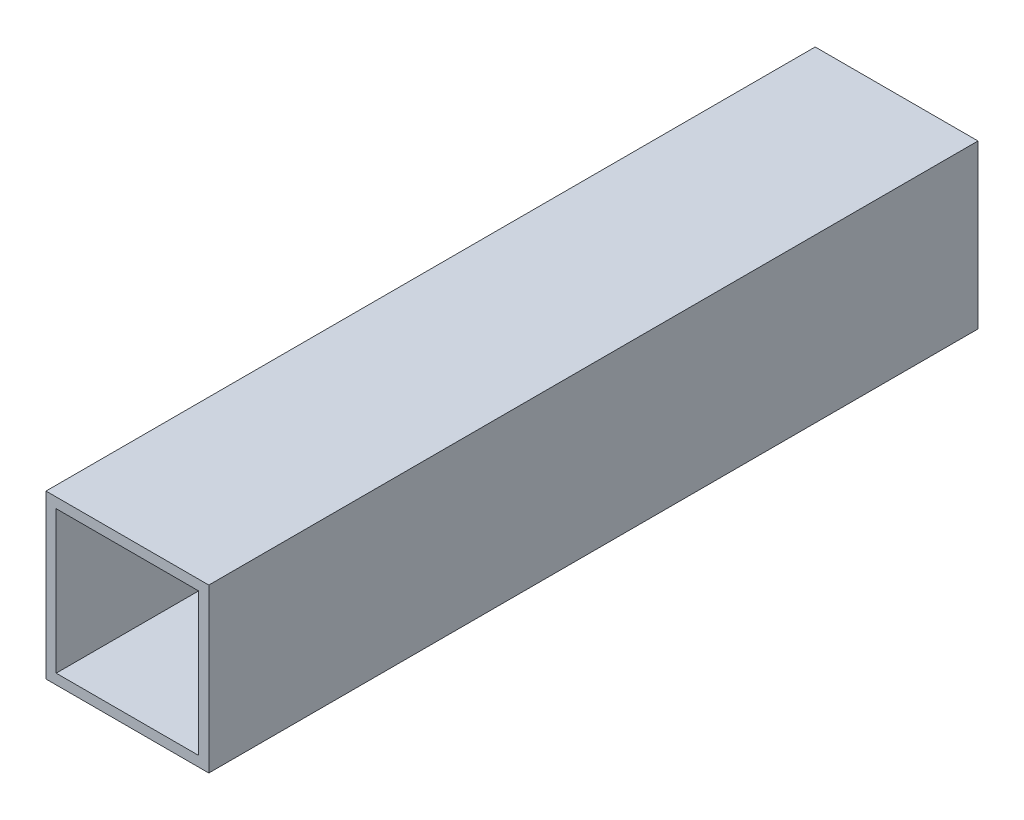
ISO-10303-21;
HEADER;
FILE_DESCRIPTION(('STEP AP214'),'2;1');
FILE_NAME('part.step','',(''),(''),'','','');
FILE_SCHEMA(('AUTOMOTIVE_DESIGN { 1 0 10303 214 1 1 1 1 }'));
ENDSEC;
DATA;
#1=APPLICATION_CONTEXT('core data for automotive mechanical design processes');
#2=APPLICATION_PROTOCOL_DEFINITION('international standard','automotive_design',2000,#1);
#3=PRODUCT_CONTEXT('',#1,'mechanical');
#4=PRODUCT('Part','Part','',(#3));
#5=PRODUCT_RELATED_PRODUCT_CATEGORY('part','',(#4));
#6=PRODUCT_DEFINITION_FORMATION('','',#4);
#7=PRODUCT_DEFINITION_CONTEXT('part definition',#1,'design');
#8=PRODUCT_DEFINITION('design','',#6,#7);
#9=PRODUCT_DEFINITION_SHAPE('','',#8);
#10=(LENGTH_UNIT() NAMED_UNIT(*) SI_UNIT(.MILLI.,.METRE.));
#11=(NAMED_UNIT(*) PLANE_ANGLE_UNIT() SI_UNIT($,.RADIAN.));
#12=(NAMED_UNIT(*) SI_UNIT($,.STERADIAN.) SOLID_ANGLE_UNIT());
#13=UNCERTAINTY_MEASURE_WITH_UNIT(LENGTH_MEASURE(1.E-05),#10,'distance_accuracy_value','');
#14=(GEOMETRIC_REPRESENTATION_CONTEXT(3) GLOBAL_UNCERTAINTY_ASSIGNED_CONTEXT((#13)) GLOBAL_UNIT_ASSIGNED_CONTEXT((#10,
#11,#12)) REPRESENTATION_CONTEXT('',''));
#15=CARTESIAN_POINT('',(0.,0.,0.));
#16=DIRECTION('',(0.,0.,1.));
#17=DIRECTION('',(1.,0.,0.));
#18=AXIS2_PLACEMENT_3D('',#15,#16,#17);
#19=CARTESIAN_POINT('',(0.,0.,120.));
#20=DIRECTION('',(0.,0.,-1.));
#21=DIRECTION('',(-1.,0.,0.));
#22=AXIS2_PLACEMENT_3D('',#19,#20,#21);
#23=PLANE('',#22);
#24=DIRECTION('',(0.,1.,0.));
#25=VECTOR('',#24,1.);
#26=CARTESIAN_POINT('',(12.7,-12.7,120.));
#27=LINE('',#26,#25);
#28=CARTESIAN_POINT('',(12.7,-12.7,120.));
#29=VERTEX_POINT('',#28);
#30=CARTESIAN_POINT('',(12.7,12.7,120.));
#31=VERTEX_POINT('',#30);
#32=EDGE_CURVE('E134',#29,#31,#27,.T.);
#33=ORIENTED_EDGE('',*,*,#32,.T.);
#34=DIRECTION('',(-1.,0.,0.));
#35=VECTOR('',#34,1.);
#36=CARTESIAN_POINT('',(-12.7,12.7,120.));
#37=LINE('',#36,#35);
#38=CARTESIAN_POINT('',(-12.7,12.7,120.));
#39=VERTEX_POINT('',#38);
#40=EDGE_CURVE('E137',#31,#39,#37,.T.);
#41=ORIENTED_EDGE('',*,*,#40,.T.);
#42=DIRECTION('',(0.,-1.,0.));
#43=VECTOR('',#42,1.);
#44=CARTESIAN_POINT('',(-12.7,-12.7,120.));
#45=LINE('',#44,#43);
#46=CARTESIAN_POINT('',(-12.7,-12.7,120.));
#47=VERTEX_POINT('',#46);
#48=EDGE_CURVE('E140',#39,#47,#45,.T.);
#49=ORIENTED_EDGE('',*,*,#48,.T.);
#50=DIRECTION('',(1.,0.,0.));
#51=VECTOR('',#50,1.);
#52=CARTESIAN_POINT('',(-12.7,-12.7,120.));
#53=LINE('',#52,#51);
#54=EDGE_CURVE('E142',#47,#29,#53,.T.);
#55=ORIENTED_EDGE('',*,*,#54,.T.);
#56=EDGE_LOOP('',(#33,#41,#49,#55));
#57=FACE_BOUND('',#56,.T.);
#58=DIRECTION('',(0.,1.,0.));
#59=VECTOR('',#58,1.);
#60=CARTESIAN_POINT('',(11.1125,-11.1125000000001,120.));
#61=LINE('',#60,#59);
#62=CARTESIAN_POINT('',(11.1125,-11.1125000000001,120.));
#63=VERTEX_POINT('',#62);
#64=CARTESIAN_POINT('',(11.1125,11.1125,120.));
#65=VERTEX_POINT('',#64);
#66=EDGE_CURVE('E98',#63,#65,#61,.T.);
#67=ORIENTED_EDGE('',*,*,#66,.F.);
#68=DIRECTION('',(1.,0.,0.));
#69=VECTOR('',#68,1.);
#70=CARTESIAN_POINT('',(-11.1125,-11.1125000000001,120.));
#71=LINE('',#70,#69);
#72=CARTESIAN_POINT('',(-11.1125,-11.1125000000001,120.));
#73=VERTEX_POINT('',#72);
#74=EDGE_CURVE('E120',#73,#63,#71,.T.);
#75=ORIENTED_EDGE('',*,*,#74,.F.);
#76=DIRECTION('',(0.,-1.,0.));
#77=VECTOR('',#76,1.);
#78=CARTESIAN_POINT('',(-11.1125,-11.1125000000001,120.));
#79=LINE('',#78,#77);
#80=CARTESIAN_POINT('',(-11.1125,11.1125,120.));
#81=VERTEX_POINT('',#80);
#82=EDGE_CURVE('E118',#81,#73,#79,.T.);
#83=ORIENTED_EDGE('',*,*,#82,.F.);
#84=DIRECTION('',(-1.,0.,0.));
#85=VECTOR('',#84,1.);
#86=CARTESIAN_POINT('',(-11.1125,11.1125,120.));
#87=LINE('',#86,#85);
#88=EDGE_CURVE('E106',#65,#81,#87,.T.);
#89=ORIENTED_EDGE('',*,*,#88,.F.);
#90=EDGE_LOOP('',(#67,#75,#83,#89));
#91=FACE_BOUND('',#90,.T.);
#92=ADVANCED_FACE('F33',(#57,#91),#23,.F.);
#93=CARTESIAN_POINT('',(0.,0.,0.));
#94=DIRECTION('',(0.,0.,-1.));
#95=DIRECTION('',(-1.,0.,0.));
#96=AXIS2_PLACEMENT_3D('',#93,#94,#95);
#97=PLANE('',#96);
#98=DIRECTION('',(0.,1.,0.));
#99=VECTOR('',#98,1.);
#100=CARTESIAN_POINT('',(12.7,-12.7,0.));
#101=LINE('',#100,#99);
#102=CARTESIAN_POINT('',(12.7,-12.7,0.));
#103=VERTEX_POINT('',#102);
#104=CARTESIAN_POINT('',(12.7,12.7,0.));
#105=VERTEX_POINT('',#104);
#106=EDGE_CURVE('E114',#103,#105,#101,.T.);
#107=ORIENTED_EDGE('',*,*,#106,.F.);
#108=DIRECTION('',(1.,0.,0.));
#109=VECTOR('',#108,1.);
#110=CARTESIAN_POINT('',(-12.7,-12.7,0.));
#111=LINE('',#110,#109);
#112=CARTESIAN_POINT('',(-12.7,-12.7,0.));
#113=VERTEX_POINT('',#112);
#114=EDGE_CURVE('E138',#113,#103,#111,.T.);
#115=ORIENTED_EDGE('',*,*,#114,.F.);
#116=DIRECTION('',(0.,-1.,0.));
#117=VECTOR('',#116,1.);
#118=CARTESIAN_POINT('',(-12.7,-12.7,0.));
#119=LINE('',#118,#117);
#120=CARTESIAN_POINT('',(-12.7,12.7,0.));
#121=VERTEX_POINT('',#120);
#122=EDGE_CURVE('E149',#121,#113,#119,.T.);
#123=ORIENTED_EDGE('',*,*,#122,.F.);
#124=DIRECTION('',(-1.,0.,0.));
#125=VECTOR('',#124,1.);
#126=CARTESIAN_POINT('',(-12.7,12.7,0.));
#127=LINE('',#126,#125);
#128=EDGE_CURVE('E147',#105,#121,#127,.T.);
#129=ORIENTED_EDGE('',*,*,#128,.F.);
#130=EDGE_LOOP('',(#107,#115,#123,#129));
#131=FACE_BOUND('',#130,.T.);
#132=DIRECTION('',(1.,0.,0.));
#133=VECTOR('',#132,1.);
#134=CARTESIAN_POINT('',(-11.1125,-11.1125000000001,0.));
#135=LINE('',#134,#133);
#136=CARTESIAN_POINT('',(-11.1125,-11.1125000000001,0.));
#137=VERTEX_POINT('',#136);
#138=CARTESIAN_POINT('',(11.1125,-11.1125000000001,0.));
#139=VERTEX_POINT('',#138);
#140=EDGE_CURVE('E107',#137,#139,#135,.T.);
#141=ORIENTED_EDGE('',*,*,#140,.T.);
#142=DIRECTION('',(0.,1.,0.));
#143=VECTOR('',#142,1.);
#144=CARTESIAN_POINT('',(11.1125,-11.1125000000001,0.));
#145=LINE('',#144,#143);
#146=CARTESIAN_POINT('',(11.1125,11.1125,0.));
#147=VERTEX_POINT('',#146);
#148=EDGE_CURVE('E56',#139,#147,#145,.T.);
#149=ORIENTED_EDGE('',*,*,#148,.T.);
#150=DIRECTION('',(-1.,0.,0.));
#151=VECTOR('',#150,1.);
#152=CARTESIAN_POINT('',(-11.1125,11.1125,0.));
#153=LINE('',#152,#151);
#154=CARTESIAN_POINT('',(-11.1125,11.1125,0.));
#155=VERTEX_POINT('',#154);
#156=EDGE_CURVE('E113',#147,#155,#153,.T.);
#157=ORIENTED_EDGE('',*,*,#156,.T.);
#158=DIRECTION('',(0.,-1.,0.));
#159=VECTOR('',#158,1.);
#160=CARTESIAN_POINT('',(-11.1125,-11.1125000000001,0.));
#161=LINE('',#160,#159);
#162=EDGE_CURVE('E126',#155,#137,#161,.T.);
#163=ORIENTED_EDGE('',*,*,#162,.T.);
#164=EDGE_LOOP('',(#141,#149,#157,#163));
#165=FACE_BOUND('',#164,.T.);
#166=ADVANCED_FACE('F167',(#131,#165),#97,.T.);
#167=CARTESIAN_POINT('',(12.7,-12.7,120.));
#168=DIRECTION('',(-1.,0.,0.));
#169=DIRECTION('',(0.,0.,1.));
#170=AXIS2_PLACEMENT_3D('',#167,#168,#169);
#171=PLANE('',#170);
#172=ORIENTED_EDGE('',*,*,#106,.T.);
#173=DIRECTION('',(0.,0.,-1.));
#174=VECTOR('',#173,1.);
#175=CARTESIAN_POINT('',(12.7,12.7,120.));
#176=LINE('',#175,#174);
#177=EDGE_CURVE('E11',#31,#105,#176,.T.);
#178=ORIENTED_EDGE('',*,*,#177,.F.);
#179=ORIENTED_EDGE('',*,*,#32,.F.);
#180=DIRECTION('',(0.,0.,-1.));
#181=VECTOR('',#180,1.);
#182=CARTESIAN_POINT('',(12.7,-12.7,120.));
#183=LINE('',#182,#181);
#184=EDGE_CURVE('E144',#29,#103,#183,.T.);
#185=ORIENTED_EDGE('',*,*,#184,.T.);
#186=EDGE_LOOP('',(#172,#178,#179,#185));
#187=FACE_BOUND('',#186,.T.);
#188=ADVANCED_FACE('F35',(#187),#171,.F.);
#189=CARTESIAN_POINT('',(-12.7,12.7,120.));
#190=DIRECTION('',(0.,-1.,0.));
#191=DIRECTION('',(0.,0.,-1.));
#192=AXIS2_PLACEMENT_3D('',#189,#190,#191);
#193=PLANE('',#192);
#194=ORIENTED_EDGE('',*,*,#128,.T.);
#195=DIRECTION('',(0.,0.,-1.));
#196=VECTOR('',#195,1.);
#197=CARTESIAN_POINT('',(-12.7,12.7,120.));
#198=LINE('',#197,#196);
#199=EDGE_CURVE('E41',#39,#121,#198,.T.);
#200=ORIENTED_EDGE('',*,*,#199,.F.);
#201=ORIENTED_EDGE('',*,*,#40,.F.);
#202=ORIENTED_EDGE('',*,*,#177,.T.);
#203=EDGE_LOOP('',(#194,#200,#201,#202));
#204=FACE_BOUND('',#203,.T.);
#205=ADVANCED_FACE('F177',(#204),#193,.F.);
#206=CARTESIAN_POINT('',(-12.7,-12.7,120.));
#207=DIRECTION('',(1.,0.,0.));
#208=DIRECTION('',(0.,0.,-1.));
#209=AXIS2_PLACEMENT_3D('',#206,#207,#208);
#210=PLANE('',#209);
#211=ORIENTED_EDGE('',*,*,#122,.T.);
#212=DIRECTION('',(0.,0.,-1.));
#213=VECTOR('',#212,1.);
#214=CARTESIAN_POINT('',(-12.7,-12.7,120.));
#215=LINE('',#214,#213);
#216=EDGE_CURVE('E154',#47,#113,#215,.T.);
#217=ORIENTED_EDGE('',*,*,#216,.F.);
#218=ORIENTED_EDGE('',*,*,#48,.F.);
#219=ORIENTED_EDGE('',*,*,#199,.T.);
#220=EDGE_LOOP('',(#211,#217,#218,#219));
#221=FACE_BOUND('',#220,.T.);
#222=ADVANCED_FACE('F161',(#221),#210,.F.);
#223=CARTESIAN_POINT('',(-12.7,-12.7,120.));
#224=DIRECTION('',(0.,1.,0.));
#225=DIRECTION('',(0.,0.,1.));
#226=AXIS2_PLACEMENT_3D('',#223,#224,#225);
#227=PLANE('',#226);
#228=ORIENTED_EDGE('',*,*,#114,.T.);
#229=ORIENTED_EDGE('',*,*,#184,.F.);
#230=ORIENTED_EDGE('',*,*,#54,.F.);
#231=ORIENTED_EDGE('',*,*,#216,.T.);
#232=EDGE_LOOP('',(#228,#229,#230,#231));
#233=FACE_BOUND('',#232,.T.);
#234=ADVANCED_FACE('F171',(#233),#227,.F.);
#235=CARTESIAN_POINT('',(11.1125,-11.1125000000001,120.));
#236=DIRECTION('',(-1.,0.,0.));
#237=DIRECTION('',(0.,0.,1.));
#238=AXIS2_PLACEMENT_3D('',#235,#236,#237);
#239=PLANE('',#238);
#240=ORIENTED_EDGE('',*,*,#148,.F.);
#241=DIRECTION('',(0.,0.,-1.));
#242=VECTOR('',#241,1.);
#243=CARTESIAN_POINT('',(11.1125,-11.1125000000001,120.));
#244=LINE('',#243,#242);
#245=EDGE_CURVE('E102',#63,#139,#244,.T.);
#246=ORIENTED_EDGE('',*,*,#245,.F.);
#247=ORIENTED_EDGE('',*,*,#66,.T.);
#248=DIRECTION('',(0.,0.,-1.));
#249=VECTOR('',#248,1.);
#250=CARTESIAN_POINT('',(11.1125,11.1125,120.));
#251=LINE('',#250,#249);
#252=EDGE_CURVE('E101',#65,#147,#251,.T.);
#253=ORIENTED_EDGE('',*,*,#252,.T.);
#254=EDGE_LOOP('',(#240,#246,#247,#253));
#255=FACE_BOUND('',#254,.T.);
#256=ADVANCED_FACE('F100',(#255),#239,.T.);
#257=CARTESIAN_POINT('',(-11.1125,11.1125,120.));
#258=DIRECTION('',(0.,-1.,0.));
#259=DIRECTION('',(1.,0.,0.));
#260=AXIS2_PLACEMENT_3D('',#257,#258,#259);
#261=PLANE('',#260);
#262=ORIENTED_EDGE('',*,*,#156,.F.);
#263=ORIENTED_EDGE('',*,*,#252,.F.);
#264=ORIENTED_EDGE('',*,*,#88,.T.);
#265=DIRECTION('',(0.,0.,-1.));
#266=VECTOR('',#265,1.);
#267=CARTESIAN_POINT('',(-11.1125,11.1125,120.));
#268=LINE('',#267,#266);
#269=EDGE_CURVE('E115',#81,#155,#268,.T.);
#270=ORIENTED_EDGE('',*,*,#269,.T.);
#271=EDGE_LOOP('',(#262,#263,#264,#270));
#272=FACE_BOUND('',#271,.T.);
#273=ADVANCED_FACE('F110',(#272),#261,.T.);
#274=CARTESIAN_POINT('',(-11.1125,-11.1125000000001,120.));
#275=DIRECTION('',(1.,0.,0.));
#276=DIRECTION('',(0.,0.,-1.));
#277=AXIS2_PLACEMENT_3D('',#274,#275,#276);
#278=PLANE('',#277);
#279=ORIENTED_EDGE('',*,*,#162,.F.);
#280=ORIENTED_EDGE('',*,*,#269,.F.);
#281=ORIENTED_EDGE('',*,*,#82,.T.);
#282=DIRECTION('',(0.,0.,-1.));
#283=VECTOR('',#282,1.);
#284=CARTESIAN_POINT('',(-11.1125,-11.1125000000001,120.));
#285=LINE('',#284,#283);
#286=EDGE_CURVE('E48',#73,#137,#285,.T.);
#287=ORIENTED_EDGE('',*,*,#286,.T.);
#288=EDGE_LOOP('',(#279,#280,#281,#287));
#289=FACE_BOUND('',#288,.T.);
#290=ADVANCED_FACE('F200',(#289),#278,.T.);
#291=CARTESIAN_POINT('',(-11.1125,-11.1125000000001,120.));
#292=DIRECTION('',(0.,1.,0.));
#293=DIRECTION('',(0.,0.,1.));
#294=AXIS2_PLACEMENT_3D('',#291,#292,#293);
#295=PLANE('',#294);
#296=ORIENTED_EDGE('',*,*,#140,.F.);
#297=ORIENTED_EDGE('',*,*,#286,.F.);
#298=ORIENTED_EDGE('',*,*,#74,.T.);
#299=ORIENTED_EDGE('',*,*,#245,.T.);
#300=EDGE_LOOP('',(#296,#297,#298,#299));
#301=FACE_BOUND('',#300,.T.);
#302=ADVANCED_FACE('F204',(#301),#295,.T.);
#303=CLOSED_SHELL('',(#92,#166,#188,#205,#222,#234,#256,#273,#290,#302));
#304=MANIFOLD_SOLID_BREP('B2',#303);
#305=ADVANCED_BREP_SHAPE_REPRESENTATION('',(#18,#304),#14);
#306=SHAPE_DEFINITION_REPRESENTATION(#9,#305);
ENDSEC;
END-ISO-10303-21;
